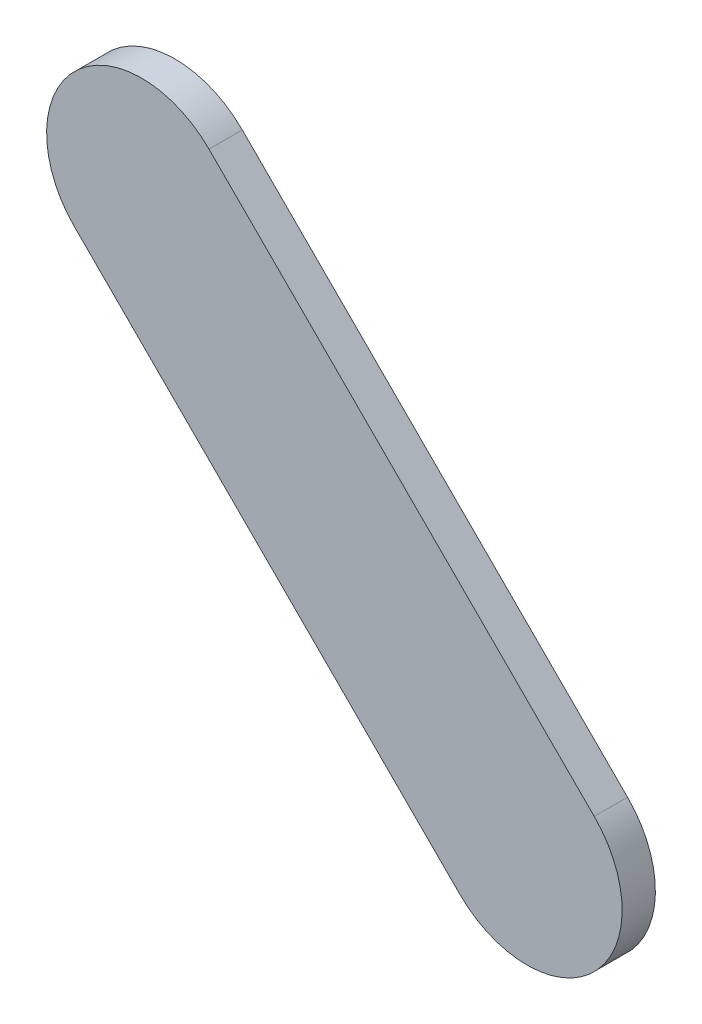
ISO-10303-21;
HEADER;
FILE_DESCRIPTION(('STEP AP214'),'2;1');
FILE_NAME('part.step','',(''),(''),'','','');
FILE_SCHEMA(('AUTOMOTIVE_DESIGN { 1 0 10303 214 1 1 1 1 }'));
ENDSEC;
DATA;
#1=APPLICATION_CONTEXT('core data for automotive mechanical design processes');
#2=APPLICATION_PROTOCOL_DEFINITION('international standard','automotive_design',2000,#1);
#3=PRODUCT_CONTEXT('',#1,'mechanical');
#4=PRODUCT('Part','Part','',(#3));
#5=PRODUCT_RELATED_PRODUCT_CATEGORY('part','',(#4));
#6=PRODUCT_DEFINITION_FORMATION('','',#4);
#7=PRODUCT_DEFINITION_CONTEXT('part definition',#1,'design');
#8=PRODUCT_DEFINITION('design','',#6,#7);
#9=PRODUCT_DEFINITION_SHAPE('','',#8);
#10=(LENGTH_UNIT() NAMED_UNIT(*) SI_UNIT(.MILLI.,.METRE.));
#11=(NAMED_UNIT(*) PLANE_ANGLE_UNIT() SI_UNIT($,.RADIAN.));
#12=(NAMED_UNIT(*) SI_UNIT($,.STERADIAN.) SOLID_ANGLE_UNIT());
#13=UNCERTAINTY_MEASURE_WITH_UNIT(LENGTH_MEASURE(1.E-05),#10,'distance_accuracy_value','');
#14=(GEOMETRIC_REPRESENTATION_CONTEXT(3) GLOBAL_UNCERTAINTY_ASSIGNED_CONTEXT((#13)) GLOBAL_UNIT_ASSIGNED_CONTEXT((#10,
#11,#12)) REPRESENTATION_CONTEXT('',''));
#15=CARTESIAN_POINT('',(0.,0.,0.));
#16=DIRECTION('',(0.,0.,1.));
#17=DIRECTION('',(1.,0.,0.));
#18=AXIS2_PLACEMENT_3D('',#15,#16,#17);
#19=CARTESIAN_POINT('',(91.029289,-123.495837,1.635));
#20=DIRECTION('',(0.,0.,1.));
#21=DIRECTION('',(1.,0.,0.));
#22=AXIS2_PLACEMENT_3D('',#19,#20,#21);
#23=PLANE('',#22);
#24=DIRECTION('',(0.707106781186548,-0.707106781186548,0.));
#25=VECTOR('',#24,1.);
#26=CARTESIAN_POINT('',(91.029289,-123.495837,1.635));
#27=LINE('',#26,#25);
#28=CARTESIAN_POINT('',(91.029289,-123.495837,1.635));
#29=VERTEX_POINT('',#28);
#30=CARTESIAN_POINT('',(91.434314,-123.900862,1.635));
#31=VERTEX_POINT('',#30);
#32=EDGE_CURVE('E79',#29,#31,#27,.T.);
#33=ORIENTED_EDGE('',*,*,#32,.T.);
#34=CARTESIAN_POINT('',(91.5050245,-123.8301515,1.635));
#35=DIRECTION('',(0.,0.,1.));
#36=DIRECTION('',(-0.707106781186048,-0.707106781187047,0.));
#37=AXIS2_PLACEMENT_3D('',#34,#35,#36);
#38=CIRCLE('',#37,0.09999974810219);
#39=CARTESIAN_POINT('',(91.575735,-123.759441,1.635));
#40=VERTEX_POINT('',#39);
#41=EDGE_CURVE('E77',#31,#40,#38,.T.);
#42=ORIENTED_EDGE('',*,*,#41,.T.);
#43=DIRECTION('',(-0.707106781186548,0.707106781186548,0.));
#44=VECTOR('',#43,1.);
#45=CARTESIAN_POINT('',(91.575735,-123.759441,1.635));
#46=LINE('',#45,#44);
#47=CARTESIAN_POINT('',(91.17071,-123.354416,1.635));
#48=VERTEX_POINT('',#47);
#49=EDGE_CURVE('E20',#40,#48,#46,.T.);
#50=ORIENTED_EDGE('',*,*,#49,.T.);
#51=CARTESIAN_POINT('',(91.0999995,-123.4251265,1.635));
#52=DIRECTION('',(0.,0.,1.));
#53=DIRECTION('',(0.707106781186548,0.707106781186548,0.));
#54=AXIS2_PLACEMENT_3D('',#51,#52,#53);
#55=CIRCLE('',#54,0.09999974810218);
#56=EDGE_CURVE('E11',#48,#29,#55,.T.);
#57=ORIENTED_EDGE('',*,*,#56,.T.);
#58=EDGE_LOOP('',(#33,#42,#50,#57));
#59=FACE_BOUND('',#58,.T.);
#60=ADVANCED_FACE('F17',(#59),#23,.T.);
#61=CARTESIAN_POINT('',(91.029289,-123.495837,1.6));
#62=DIRECTION('',(0.,0.,1.));
#63=DIRECTION('',(1.,0.,0.));
#64=AXIS2_PLACEMENT_3D('',#61,#62,#63);
#65=PLANE('',#64);
#66=CARTESIAN_POINT('',(91.0999995,-123.4251265,1.6));
#67=DIRECTION('',(0.,0.,1.));
#68=DIRECTION('',(0.707106781186548,0.707106781186548,0.));
#69=AXIS2_PLACEMENT_3D('',#66,#67,#68);
#70=CIRCLE('',#69,0.09999974810218);
#71=CARTESIAN_POINT('',(91.17071,-123.354416,1.6));
#72=VERTEX_POINT('',#71);
#73=CARTESIAN_POINT('',(91.029289,-123.495837,1.6));
#74=VERTEX_POINT('',#73);
#75=EDGE_CURVE('E27',#72,#74,#70,.T.);
#76=ORIENTED_EDGE('',*,*,#75,.F.);
#77=DIRECTION('',(-0.707106781186548,0.707106781186548,0.));
#78=VECTOR('',#77,1.);
#79=CARTESIAN_POINT('',(91.575735,-123.759441,1.6));
#80=LINE('',#79,#78);
#81=CARTESIAN_POINT('',(91.575735,-123.759441,1.6));
#82=VERTEX_POINT('',#81);
#83=EDGE_CURVE('E61',#82,#72,#80,.T.);
#84=ORIENTED_EDGE('',*,*,#83,.F.);
#85=CARTESIAN_POINT('',(91.5050245,-123.8301515,1.6));
#86=DIRECTION('',(0.,0.,1.));
#87=DIRECTION('',(-0.707106781186048,-0.707106781187047,0.));
#88=AXIS2_PLACEMENT_3D('',#85,#86,#87);
#89=CIRCLE('',#88,0.09999974810219);
#90=CARTESIAN_POINT('',(91.434314,-123.900862,1.6));
#91=VERTEX_POINT('',#90);
#92=EDGE_CURVE('E86',#91,#82,#89,.T.);
#93=ORIENTED_EDGE('',*,*,#92,.F.);
#94=DIRECTION('',(0.707106781186548,-0.707106781186548,0.));
#95=VECTOR('',#94,1.);
#96=CARTESIAN_POINT('',(91.029289,-123.495837,1.6));
#97=LINE('',#96,#95);
#98=EDGE_CURVE('E106',#74,#91,#97,.T.);
#99=ORIENTED_EDGE('',*,*,#98,.F.);
#100=EDGE_LOOP('',(#76,#84,#93,#99));
#101=FACE_BOUND('',#100,.T.);
#102=ADVANCED_FACE('F176',(#101),#65,.F.);
#103=CARTESIAN_POINT('',(91.0999995,-123.4251265,1.6));
#104=DIRECTION('',(0.,0.,-1.));
#105=DIRECTION('',(0.707106781186548,0.707106781186548,0.));
#106=AXIS2_PLACEMENT_3D('',#103,#104,#105);
#107=CYLINDRICAL_SURFACE('',#106,0.09999974810218);
#108=ORIENTED_EDGE('',*,*,#75,.T.);
#109=DIRECTION('',(0.,0.,1.));
#110=VECTOR('',#109,1.);
#111=CARTESIAN_POINT('',(91.029289,-123.495837,1.6));
#112=LINE('',#111,#110);
#113=EDGE_CURVE('E92',#74,#29,#112,.T.);
#114=ORIENTED_EDGE('',*,*,#113,.T.);
#115=ORIENTED_EDGE('',*,*,#56,.F.);
#116=DIRECTION('',(0.,0.,1.));
#117=VECTOR('',#116,1.);
#118=CARTESIAN_POINT('',(91.17071,-123.354416,1.6));
#119=LINE('',#118,#117);
#120=EDGE_CURVE('E73',#72,#48,#119,.T.);
#121=ORIENTED_EDGE('',*,*,#120,.F.);
#122=EDGE_LOOP('',(#108,#114,#115,#121));
#123=FACE_BOUND('',#122,.T.);
#124=ADVANCED_FACE('F168',(#123),#107,.T.);
#125=CARTESIAN_POINT('',(91.575735,-123.759441,1.6));
#126=DIRECTION('',(-0.707106781186548,-0.707106781186548,0.));
#127=DIRECTION('',(-0.707106781186548,0.707106781186548,0.));
#128=AXIS2_PLACEMENT_3D('',#125,#126,#127);
#129=PLANE('',#128);
#130=ORIENTED_EDGE('',*,*,#83,.T.);
#131=ORIENTED_EDGE('',*,*,#120,.T.);
#132=ORIENTED_EDGE('',*,*,#49,.F.);
#133=DIRECTION('',(0.,0.,1.));
#134=VECTOR('',#133,1.);
#135=CARTESIAN_POINT('',(91.575735,-123.759441,1.6));
#136=LINE('',#135,#134);
#137=EDGE_CURVE('E71',#82,#40,#136,.T.);
#138=ORIENTED_EDGE('',*,*,#137,.F.);
#139=EDGE_LOOP('',(#130,#131,#132,#138));
#140=FACE_BOUND('',#139,.T.);
#141=ADVANCED_FACE('F69',(#140),#129,.F.);
#142=CARTESIAN_POINT('',(91.5050245,-123.8301515,1.6));
#143=DIRECTION('',(0.,0.,-1.));
#144=DIRECTION('',(-0.707106781186048,-0.707106781187048,0.));
#145=AXIS2_PLACEMENT_3D('',#142,#143,#144);
#146=CYLINDRICAL_SURFACE('',#145,0.09999974810219);
#147=ORIENTED_EDGE('',*,*,#92,.T.);
#148=ORIENTED_EDGE('',*,*,#137,.T.);
#149=ORIENTED_EDGE('',*,*,#41,.F.);
#150=DIRECTION('',(0.,0.,1.));
#151=VECTOR('',#150,1.);
#152=CARTESIAN_POINT('',(91.434314,-123.900862,1.6));
#153=LINE('',#152,#151);
#154=EDGE_CURVE('E103',#91,#31,#153,.T.);
#155=ORIENTED_EDGE('',*,*,#154,.F.);
#156=EDGE_LOOP('',(#147,#148,#149,#155));
#157=FACE_BOUND('',#156,.T.);
#158=ADVANCED_FACE('F85',(#157),#146,.T.);
#159=CARTESIAN_POINT('',(91.029289,-123.495837,1.6));
#160=DIRECTION('',(0.707106781186548,0.707106781186548,0.));
#161=DIRECTION('',(0.,0.,-1.));
#162=AXIS2_PLACEMENT_3D('',#159,#160,#161);
#163=PLANE('',#162);
#164=ORIENTED_EDGE('',*,*,#98,.T.);
#165=ORIENTED_EDGE('',*,*,#154,.T.);
#166=ORIENTED_EDGE('',*,*,#32,.F.);
#167=ORIENTED_EDGE('',*,*,#113,.F.);
#168=EDGE_LOOP('',(#164,#165,#166,#167));
#169=FACE_BOUND('',#168,.T.);
#170=ADVANCED_FACE('F141',(#169),#163,.F.);
#171=CLOSED_SHELL('',(#60,#102,#124,#141,#158,#170));
#172=MANIFOLD_SOLID_BREP('B1',#171);
#173=ADVANCED_BREP_SHAPE_REPRESENTATION('',(#18,#172),#14);
#174=SHAPE_DEFINITION_REPRESENTATION(#9,#173);
ENDSEC;
END-ISO-10303-21;
